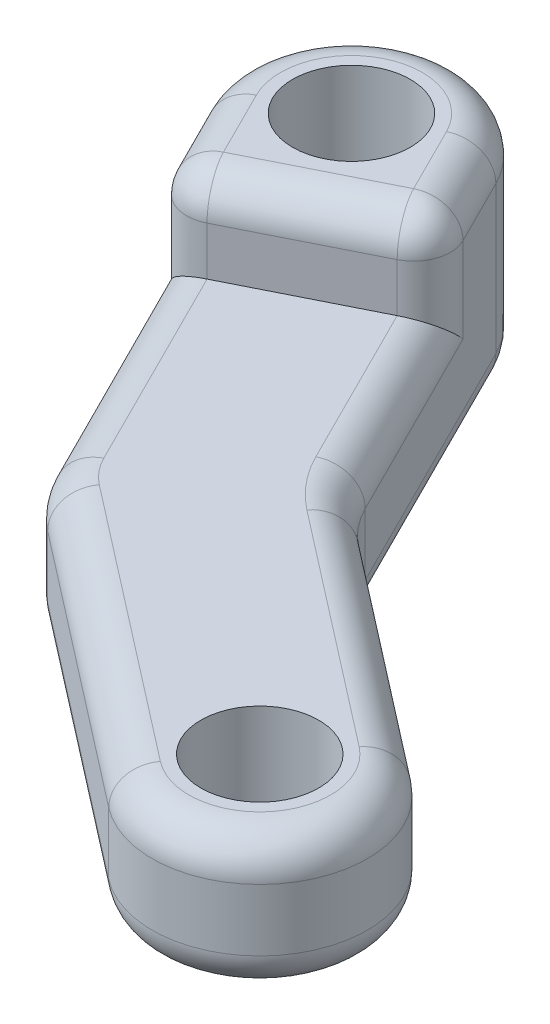
ISO-10303-21;
HEADER;
FILE_DESCRIPTION(('STEP AP214'),'2;1');
FILE_NAME('part.step','',(''),(''),'','','');
FILE_SCHEMA(('AUTOMOTIVE_DESIGN { 1 0 10303 214 1 1 1 1 }'));
ENDSEC;
DATA;
#1=APPLICATION_CONTEXT('core data for automotive mechanical design processes');
#2=APPLICATION_PROTOCOL_DEFINITION('international standard','automotive_design',2000,#1);
#3=PRODUCT_CONTEXT('',#1,'mechanical');
#4=PRODUCT('Part','Part','',(#3));
#5=PRODUCT_RELATED_PRODUCT_CATEGORY('part','',(#4));
#6=PRODUCT_DEFINITION_FORMATION('','',#4);
#7=PRODUCT_DEFINITION_CONTEXT('part definition',#1,'design');
#8=PRODUCT_DEFINITION('design','',#6,#7);
#9=PRODUCT_DEFINITION_SHAPE('','',#8);
#10=(LENGTH_UNIT() NAMED_UNIT(*) SI_UNIT(.MILLI.,.METRE.));
#11=(NAMED_UNIT(*) PLANE_ANGLE_UNIT() SI_UNIT($,.RADIAN.));
#12=(NAMED_UNIT(*) SI_UNIT($,.STERADIAN.) SOLID_ANGLE_UNIT());
#13=UNCERTAINTY_MEASURE_WITH_UNIT(LENGTH_MEASURE(1.E-05),#10,'distance_accuracy_value','');
#14=(GEOMETRIC_REPRESENTATION_CONTEXT(3) GLOBAL_UNCERTAINTY_ASSIGNED_CONTEXT((#13)) GLOBAL_UNIT_ASSIGNED_CONTEXT((#10,
#11,#12)) REPRESENTATION_CONTEXT('',''));
#15=CARTESIAN_POINT('',(0.,0.,0.));
#16=DIRECTION('',(0.,0.,1.));
#17=DIRECTION('',(1.,0.,0.));
#18=AXIS2_PLACEMENT_3D('',#15,#16,#17);
#19=CARTESIAN_POINT('',(-2.65869303179562,6.,-9.54953392256983));
#20=DIRECTION('',(0.,1.,0.));
#21=DIRECTION('',(0.,0.,1.));
#22=AXIS2_PLACEMENT_3D('',#19,#20,#21);
#23=PLANE('',#22);
#24=CARTESIAN_POINT('',(-11.5139500474512,6.,-14.0044940752888));
#25=DIRECTION('',(0.,1.,0.));
#26=DIRECTION('',(0.,0.,1.));
#27=AXIS2_PLACEMENT_3D('',#24,#25,#26);
#28=CIRCLE('',#27,1.6);
#29=CARTESIAN_POINT('',(-11.5139500474512,6.,-12.4044940752888));
#30=VERTEX_POINT('',#29);
#31=EDGE_CURVE('E196',#30,#30,#28,.T.);
#32=ORIENTED_EDGE('',*,*,#31,.F.);
#33=EDGE_LOOP('',(#32));
#34=FACE_BOUND('',#33,.T.);
#35=DIRECTION('',(0.447558447039831,0.,0.894254682114271));
#36=VECTOR('',#35,1.);
#37=CARTESIAN_POINT('',(-9.08189431283237,6.,-4.84395369232321));
#38=LINE('',#37,#36);
#39=CARTESIAN_POINT('',(-13.2353903105212,6.,-13.1429440647371));
#40=VERTEX_POINT('',#39);
#41=CARTESIAN_POINT('',(-12.3402734164415,6.,-11.3544347005086));
#42=VERTEX_POINT('',#41);
#43=EDGE_CURVE('E216',#40,#42,#38,.T.);
#44=ORIENTED_EDGE('',*,*,#43,.T.);
#45=DIRECTION('',(0.894254682114271,0.,-0.447558447039831));
#46=VECTOR('',#45,1.);
#47=CARTESIAN_POINT('',(-5.32037416184447,6.,-14.8677685097713));
#48=LINE('',#47,#46);
#49=CARTESIAN_POINT('',(-8.89739289030155,6.,-13.0775347216119));
#50=VERTEX_POINT('',#49);
#51=EDGE_CURVE('E344',#42,#50,#48,.T.);
#52=ORIENTED_EDGE('',*,*,#51,.T.);
#53=DIRECTION('',(-0.447558447039831,0.,-0.894254682114271));
#54=VECTOR('',#53,1.);
#55=CARTESIAN_POINT('',(-9.79250978438121,6.,-14.8660440858405));
#56=LINE('',#55,#54);
#57=CARTESIAN_POINT('',(-9.79250978438121,6.,-14.8660440858405));
#58=VERTEX_POINT('',#57);
#59=EDGE_CURVE('E270',#50,#58,#56,.T.);
#60=ORIENTED_EDGE('',*,*,#59,.T.);
#61=CARTESIAN_POINT('',(-11.5139500474512,6.,-14.0044940752888));
#62=DIRECTION('',(0.,1.,0.));
#63=DIRECTION('',(0.,0.,1.));
#64=AXIS2_PLACEMENT_3D('',#61,#62,#63);
#65=CIRCLE('',#64,1.925);
#66=EDGE_CURVE('E266',#58,#40,#65,.T.);
#67=ORIENTED_EDGE('',*,*,#66,.T.);
#68=EDGE_LOOP('',(#44,#52,#60,#67));
#69=FACE_BOUND('',#68,.T.);
#70=ADVANCED_FACE('F41',(#34,#69),#23,.T.);
#71=CARTESIAN_POINT('',(-2.65869303179562,6.,-9.54953392256983));
#72=DIRECTION('',(0.,-1.,0.));
#73=DIRECTION('',(0.,0.,-1.));
#74=AXIS2_PLACEMENT_3D('',#71,#72,#73);
#75=CYLINDRICAL_SURFACE('',#74,3.);
#76=DIRECTION('',(0.,-1.,0.));
#77=VECTOR('',#76,1.);
#78=CARTESIAN_POINT('',(-5.34145707813843,6.,-8.20685858145034));
#79=LINE('',#78,#77);
#80=CARTESIAN_POINT('',(-5.34145707813843,2.6825,-8.20685858145034));
#81=VERTEX_POINT('',#80);
#82=CARTESIAN_POINT('',(-5.34145707813843,1.,-8.20685858145034));
#83=VERTEX_POINT('',#82);
#84=EDGE_CURVE('E223',#81,#83,#79,.T.);
#85=ORIENTED_EDGE('',*,*,#84,.F.);
#86=CARTESIAN_POINT('',(-2.65869303179562,2.6825,-9.54953392256983));
#87=DIRECTION('',(0.,1.,0.));
#88=DIRECTION('',(0.,0.,1.));
#89=AXIS2_PLACEMENT_3D('',#86,#87,#88);
#90=CIRCLE('',#89,3.);
#91=CARTESIAN_POINT('',(-4.49475360434081,2.6825,-7.17700751092653));
#92=VERTEX_POINT('',#91);
#93=EDGE_CURVE('E193',#81,#92,#90,.T.);
#94=ORIENTED_EDGE('',*,*,#93,.T.);
#95=DIRECTION('',(0.,-1.,0.));
#96=VECTOR('',#95,1.);
#97=CARTESIAN_POINT('',(-4.49475360434081,6.,-7.17700751092653));
#98=LINE('',#97,#96);
#99=CARTESIAN_POINT('',(-4.49475360434081,1.,-7.17700751092653));
#100=VERTEX_POINT('',#99);
#101=EDGE_CURVE('E187',#92,#100,#98,.T.);
#102=ORIENTED_EDGE('',*,*,#101,.T.);
#103=CARTESIAN_POINT('',(-2.65869303179562,1.,-9.54953392256983));
#104=DIRECTION('',(0.,1.,0.));
#105=DIRECTION('',(0.,0.,1.));
#106=AXIS2_PLACEMENT_3D('',#103,#104,#105);
#107=CIRCLE('',#106,3.);
#108=EDGE_CURVE('E191',#100,#83,#107,.F.);
#109=ORIENTED_EDGE('',*,*,#108,.T.);
#110=EDGE_LOOP('',(#85,#94,#102,#109));
#111=FACE_BOUND('',#110,.T.);
#112=ADVANCED_FACE('F186',(#111),#75,.F.);
#113=CARTESIAN_POINT('',(-8.89825510226694,6.,-15.3136025328803));
#114=DIRECTION('',(-0.89425468211427,0.,0.447558447039831));
#115=DIRECTION('',(0.447558447039831,0.,0.894254682114271));
#116=AXIS2_PLACEMENT_3D('',#113,#114,#115);
#117=PLANE('',#116);
#118=DIRECTION('',(-0.447558447039831,0.,-0.894254682114271));
#119=VECTOR('',#118,1.);
#120=CARTESIAN_POINT('',(-5.34145707813843,5.,-8.20685858145034));
#121=LINE('',#120,#119);
#122=CARTESIAN_POINT('',(-8.89825510226694,5.,-15.3136025328803));
#123=VERTEX_POINT('',#122);
#124=CARTESIAN_POINT('',(-8.00313820818728,5.,-13.5250931686518));
#125=VERTEX_POINT('',#124);
#126=EDGE_CURVE('E264',#123,#125,#121,.F.);
#127=ORIENTED_EDGE('',*,*,#126,.T.);
#128=DIRECTION('',(0.,1.,0.));
#129=VECTOR('',#128,1.);
#130=CARTESIAN_POINT('',(-8.00313820818728,2.6825,-13.5250931686518));
#131=LINE('',#130,#129);
#132=CARTESIAN_POINT('',(-8.00313820818728,2.6825,-13.5250931686518));
#133=VERTEX_POINT('',#132);
#134=EDGE_CURVE('E357',#125,#133,#131,.F.);
#135=ORIENTED_EDGE('',*,*,#134,.T.);
#136=DIRECTION('',(0.447558447039831,0.,0.894254682114271));
#137=VECTOR('',#136,1.);
#138=CARTESIAN_POINT('',(-5.34145707813843,2.6825,-8.20685858145034));
#139=LINE('',#138,#137);
#140=EDGE_CURVE('E60',#133,#81,#139,.T.);
#141=ORIENTED_EDGE('',*,*,#140,.T.);
#142=ORIENTED_EDGE('',*,*,#84,.T.);
#143=DIRECTION('',(-0.447558447039831,0.,-0.894254682114271));
#144=VECTOR('',#143,1.);
#145=CARTESIAN_POINT('',(-8.89825510226694,1.,-15.3136025328803));
#146=LINE('',#145,#144);
#147=CARTESIAN_POINT('',(-8.89825510226694,1.,-15.3136025328803));
#148=VERTEX_POINT('',#147);
#149=EDGE_CURVE('E263',#83,#148,#146,.T.);
#150=ORIENTED_EDGE('',*,*,#149,.T.);
#151=DIRECTION('',(0.,-1.,0.));
#152=VECTOR('',#151,1.);
#153=CARTESIAN_POINT('',(-8.89825510226694,6.,-15.3136025328803));
#154=LINE('',#153,#152);
#155=EDGE_CURVE('E230',#123,#148,#154,.T.);
#156=ORIENTED_EDGE('',*,*,#155,.F.);
#157=EDGE_LOOP('',(#127,#135,#141,#142,#150,#156));
#158=FACE_BOUND('',#157,.T.);
#159=ADVANCED_FACE('F379',(#158),#117,.F.);
#160=CARTESIAN_POINT('',(-14.1296449926354,6.,-12.6953856176973));
#161=DIRECTION('',(0.89425468211427,0.,-0.447558447039831));
#162=DIRECTION('',(-0.447558447039831,0.,-0.894254682114271));
#163=AXIS2_PLACEMENT_3D('',#160,#161,#162);
#164=PLANE('',#163);
#165=DIRECTION('',(-0.447558447039831,0.,-0.894254682114271));
#166=VECTOR('',#165,1.);
#167=CARTESIAN_POINT('',(-12.7869696515159,2.6825,-10.0126215713545));
#168=LINE('',#167,#166);
#169=CARTESIAN_POINT('',(-9.97614899494664,2.6825,-4.39639524528338));
#170=VERTEX_POINT('',#169);
#171=CARTESIAN_POINT('',(-13.2345280985558,2.6825,-10.9068762534687));
#172=VERTEX_POINT('',#171);
#173=EDGE_CURVE('E64',#170,#172,#168,.T.);
#174=ORIENTED_EDGE('',*,*,#173,.T.);
#175=DIRECTION('',(0.,1.,0.));
#176=VECTOR('',#175,1.);
#177=CARTESIAN_POINT('',(-13.2345280985558,5.,-10.9068762534687));
#178=LINE('',#177,#176);
#179=CARTESIAN_POINT('',(-13.2345280985558,5.,-10.9068762534687));
#180=VERTEX_POINT('',#179);
#181=EDGE_CURVE('E353',#172,#180,#178,.T.);
#182=ORIENTED_EDGE('',*,*,#181,.T.);
#183=DIRECTION('',(0.447558447039831,0.,0.894254682114271));
#184=VECTOR('',#183,1.);
#185=CARTESIAN_POINT('',(-14.1296449926354,5.,-12.6953856176973));
#186=LINE('',#185,#184);
#187=CARTESIAN_POINT('',(-14.1296449926354,5.,-12.6953856176973));
#188=VERTEX_POINT('',#187);
#189=EDGE_CURVE('E254',#180,#188,#186,.F.);
#190=ORIENTED_EDGE('',*,*,#189,.T.);
#191=DIRECTION('',(0.,-1.,0.));
#192=VECTOR('',#191,1.);
#193=CARTESIAN_POINT('',(-14.1296449926354,6.,-12.6953856176973));
#194=LINE('',#193,#192);
#195=CARTESIAN_POINT('',(-14.1296449926354,1.,-12.6953856176973));
#196=VERTEX_POINT('',#195);
#197=EDGE_CURVE('E555',#188,#196,#194,.T.);
#198=ORIENTED_EDGE('',*,*,#197,.T.);
#199=DIRECTION('',(0.447558447039831,0.,0.894254682114271));
#200=VECTOR('',#199,1.);
#201=CARTESIAN_POINT('',(-14.1296449926354,1.,-12.6953856176973));
#202=LINE('',#201,#200);
#203=CARTESIAN_POINT('',(-9.97614899494664,1.,-4.39639524528338));
#204=VERTEX_POINT('',#203);
#205=EDGE_CURVE('E253',#196,#204,#202,.T.);
#206=ORIENTED_EDGE('',*,*,#205,.T.);
#207=DIRECTION('',(0.,-1.,0.));
#208=VECTOR('',#207,1.);
#209=CARTESIAN_POINT('',(-9.97614899494664,6.,-4.39639524528338));
#210=LINE('',#209,#208);
#211=EDGE_CURVE('E552',#170,#204,#210,.T.);
#212=ORIENTED_EDGE('',*,*,#211,.F.);
#213=EDGE_LOOP('',(#174,#182,#190,#198,#206,#212));
#214=FACE_BOUND('',#213,.T.);
#215=ADVANCED_FACE('F450',(#214),#164,.F.);
#216=CARTESIAN_POINT('',(-7.29338494860383,6.,-5.73907058640287));
#217=DIRECTION('',(0.,-1.,0.));
#218=DIRECTION('',(0.,0.,-1.));
#219=AXIS2_PLACEMENT_3D('',#216,#217,#218);
#220=CYLINDRICAL_SURFACE('',#219,3.);
#221=DIRECTION('',(0.,-1.,0.));
#222=VECTOR('',#221,1.);
#223=CARTESIAN_POINT('',(-9.12944552114902,6.,-3.36654417475957));
#224=LINE('',#223,#222);
#225=CARTESIAN_POINT('',(-9.12944552114902,2.6825,-3.36654417475957));
#226=VERTEX_POINT('',#225);
#227=CARTESIAN_POINT('',(-9.12944552114902,1.,-3.36654417475957));
#228=VERTEX_POINT('',#227);
#229=EDGE_CURVE('E548',#226,#228,#224,.T.);
#230=ORIENTED_EDGE('',*,*,#229,.F.);
#231=CARTESIAN_POINT('',(-7.29338494860383,2.6825,-5.73907058640287));
#232=DIRECTION('',(0.,1.,0.));
#233=DIRECTION('',(0.,0.,1.));
#234=AXIS2_PLACEMENT_3D('',#231,#232,#233);
#235=CIRCLE('',#234,3.);
#236=EDGE_CURVE('E312',#226,#170,#235,.F.);
#237=ORIENTED_EDGE('',*,*,#236,.T.);
#238=ORIENTED_EDGE('',*,*,#211,.T.);
#239=CARTESIAN_POINT('',(-7.29338494860383,1.,-5.73907058640287));
#240=DIRECTION('',(0.,1.,0.));
#241=DIRECTION('',(0.,0.,1.));
#242=AXIS2_PLACEMENT_3D('',#239,#240,#241);
#243=CIRCLE('',#242,3.);
#244=EDGE_CURVE('E249',#204,#228,#243,.T.);
#245=ORIENTED_EDGE('',*,*,#244,.T.);
#246=EDGE_LOOP('',(#230,#237,#238,#245));
#247=FACE_BOUND('',#246,.T.);
#248=ADVANCED_FACE('F442',(#247),#220,.T.);
#249=CARTESIAN_POINT('',(-9.12944552114902,6.,-3.36654417475957));
#250=DIRECTION('',(0.612020190848396,0.,-0.790842137214433));
#251=DIRECTION('',(-0.790842137214433,0.,-0.612020190848396));
#252=AXIS2_PLACEMENT_3D('',#249,#250,#251);
#253=PLANE('',#252);
#254=DIRECTION('',(0.,-1.,0.));
#255=VECTOR('',#254,1.);
#256=CARTESIAN_POINT('',(-1.79015905823156,6.,2.31321325135222));
#257=LINE('',#256,#255);
#258=CARTESIAN_POINT('',(-1.79015905823156,2.6825,2.31321325135222));
#259=VERTEX_POINT('',#258);
#260=CARTESIAN_POINT('',(-1.79015905823156,1.,2.31321325135222));
#261=VERTEX_POINT('',#260);
#262=EDGE_CURVE('E549',#259,#261,#257,.T.);
#263=ORIENTED_EDGE('',*,*,#262,.F.);
#264=DIRECTION('',(-0.790842137214433,0.,-0.612020190848396));
#265=VECTOR('',#264,1.);
#266=CARTESIAN_POINT('',(-9.12944552114902,2.6825,-3.36654417475957));
#267=LINE('',#266,#265);
#268=EDGE_CURVE('E314',#259,#226,#267,.T.);
#269=ORIENTED_EDGE('',*,*,#268,.T.);
#270=ORIENTED_EDGE('',*,*,#229,.T.);
#271=DIRECTION('',(0.790842137214433,0.,0.612020190848396));
#272=VECTOR('',#271,1.);
#273=CARTESIAN_POINT('',(-9.12944552114902,1.,-3.36654417475957));
#274=LINE('',#273,#272);
#275=EDGE_CURVE('E250',#228,#261,#274,.T.);
#276=ORIENTED_EDGE('',*,*,#275,.T.);
#277=EDGE_LOOP('',(#263,#269,#270,#276));
#278=FACE_BOUND('',#277,.T.);
#279=ADVANCED_FACE('F437',(#278),#253,.F.);
#280=CARTESIAN_POINT('',(0.,6.,0.));
#281=DIRECTION('',(0.,-1.,0.));
#282=DIRECTION('',(0.,0.,-1.));
#283=AXIS2_PLACEMENT_3D('',#280,#281,#282);
#284=CYLINDRICAL_SURFACE('',#283,2.925);
#285=DIRECTION('',(0.,-1.,0.));
#286=VECTOR('',#285,1.);
#287=CARTESIAN_POINT('',(1.79015905823156,6.,-2.31321325135222));
#288=LINE('',#287,#286);
#289=CARTESIAN_POINT('',(1.79015905823156,2.6825,-2.31321325135222));
#290=VERTEX_POINT('',#289);
#291=CARTESIAN_POINT('',(1.79015905823156,1.,-2.31321325135222));
#292=VERTEX_POINT('',#291);
#293=EDGE_CURVE('E200',#290,#292,#288,.T.);
#294=ORIENTED_EDGE('',*,*,#293,.F.);
#295=CARTESIAN_POINT('',(0.,2.6825,0.));
#296=DIRECTION('',(0.,1.,0.));
#297=DIRECTION('',(0.,0.,1.));
#298=AXIS2_PLACEMENT_3D('',#295,#296,#297);
#299=CIRCLE('',#298,2.925);
#300=EDGE_CURVE('E321',#290,#259,#299,.F.);
#301=ORIENTED_EDGE('',*,*,#300,.T.);
#302=ORIENTED_EDGE('',*,*,#262,.T.);
#303=CARTESIAN_POINT('',(0.,1.,0.));
#304=DIRECTION('',(0.,1.,0.));
#305=DIRECTION('',(0.,0.,1.));
#306=AXIS2_PLACEMENT_3D('',#303,#304,#305);
#307=CIRCLE('',#306,2.925);
#308=EDGE_CURVE('E244',#261,#292,#307,.T.);
#309=ORIENTED_EDGE('',*,*,#308,.T.);
#310=EDGE_LOOP('',(#294,#301,#302,#309));
#311=FACE_BOUND('',#310,.T.);
#312=ADVANCED_FACE('F436',(#311),#284,.T.);
#313=CARTESIAN_POINT('',(-4.49475360434081,6.,-7.17700751092653));
#314=DIRECTION('',(-0.612020190848396,0.,0.790842137214433));
#315=DIRECTION('',(0.790842137214433,0.,0.612020190848396));
#316=AXIS2_PLACEMENT_3D('',#313,#314,#315);
#317=PLANE('',#316);
#318=ORIENTED_EDGE('',*,*,#101,.F.);
#319=DIRECTION('',(0.790842137214433,0.,0.612020190848396));
#320=VECTOR('',#319,1.);
#321=CARTESIAN_POINT('',(1.79015905823156,2.6825,-2.31321325135222));
#322=LINE('',#321,#320);
#323=EDGE_CURVE('E316',#92,#290,#322,.T.);
#324=ORIENTED_EDGE('',*,*,#323,.T.);
#325=ORIENTED_EDGE('',*,*,#293,.T.);
#326=DIRECTION('',(-0.790842137214433,0.,-0.612020190848396));
#327=VECTOR('',#326,1.);
#328=CARTESIAN_POINT('',(-4.49475360434081,1.,-7.17700751092653));
#329=LINE('',#328,#327);
#330=EDGE_CURVE('E210',#292,#100,#329,.T.);
#331=ORIENTED_EDGE('',*,*,#330,.T.);
#332=EDGE_LOOP('',(#318,#324,#325,#331));
#333=FACE_BOUND('',#332,.T.);
#334=ADVANCED_FACE('F222',(#333),#317,.F.);
#335=CARTESIAN_POINT('',(0.,6.,0.));
#336=DIRECTION('',(0.,-1.,0.));
#337=DIRECTION('',(0.,0.,-1.));
#338=AXIS2_PLACEMENT_3D('',#335,#336,#337);
#339=CYLINDRICAL_SURFACE('',#338,1.6);
#340=CARTESIAN_POINT('',(0.,0.,0.));
#341=DIRECTION('',(0.,1.,0.));
#342=DIRECTION('',(0.,0.,1.));
#343=AXIS2_PLACEMENT_3D('',#340,#341,#342);
#344=CIRCLE('',#343,1.6);
#345=CARTESIAN_POINT('',(0.,0.,1.6));
#346=VERTEX_POINT('',#345);
#347=EDGE_CURVE('E288',#346,#346,#344,.T.);
#348=ORIENTED_EDGE('',*,*,#347,.F.);
#349=EDGE_LOOP('',(#348));
#350=FACE_BOUND('',#349,.T.);
#351=CARTESIAN_POINT('',(0.,3.6825,0.));
#352=DIRECTION('',(0.,1.,0.));
#353=DIRECTION('',(0.,0.,1.));
#354=AXIS2_PLACEMENT_3D('',#351,#352,#353);
#355=CIRCLE('',#354,1.6);
#356=CARTESIAN_POINT('',(0.,3.6825,1.6));
#357=VERTEX_POINT('',#356);
#358=EDGE_CURVE('E295',#357,#357,#355,.F.);
#359=ORIENTED_EDGE('',*,*,#358,.F.);
#360=EDGE_LOOP('',(#359));
#361=FACE_BOUND('',#360,.T.);
#362=ADVANCED_FACE('F434',(#350,#361),#339,.F.);
#363=CARTESIAN_POINT('',(-9.67859228639264,5.,-6.03620011330716));
#364=DIRECTION('',(-0.447558447039831,0.,-0.894254682114271));
#365=DIRECTION('',(-0.89425468211427,0.,0.447558447039831));
#366=AXIS2_PLACEMENT_3D('',#363,#364,#365);
#367=CYLINDRICAL_SURFACE('',#366,1.);
#368=ORIENTED_EDGE('',*,*,#189,.F.);
#369=CARTESIAN_POINT('',(-12.3402734164415,5.,-11.3544347005086));
#370=DIRECTION('',(-0.447558447039831,0.,-0.894254682114271));
#371=DIRECTION('',(-0.89425468211427,0.,0.447558447039831));
#372=AXIS2_PLACEMENT_3D('',#369,#370,#371);
#373=CIRCLE('',#372,1.);
#374=EDGE_CURVE('E322',#180,#42,#373,.T.);
#375=ORIENTED_EDGE('',*,*,#374,.T.);
#376=ORIENTED_EDGE('',*,*,#43,.F.);
#377=CARTESIAN_POINT('',(-13.2353903105212,5.,-13.1429440647371));
#378=DIRECTION('',(-0.447558447039831,0.,-0.89425468211427));
#379=DIRECTION('',(-0.89425468211427,0.,0.447558447039831));
#380=AXIS2_PLACEMENT_3D('',#377,#378,#379);
#381=CIRCLE('',#380,1.);
#382=EDGE_CURVE('E212',#188,#40,#381,.T.);
#383=ORIENTED_EDGE('',*,*,#382,.F.);
#384=EDGE_LOOP('',(#368,#375,#376,#383));
#385=FACE_BOUND('',#384,.T.);
#386=ADVANCED_FACE('F400',(#385),#367,.T.);
#387=CARTESIAN_POINT('',(-6.2357117602527,5.,-7.75930013441051));
#388=DIRECTION('',(0.447558447039831,0.,0.894254682114271));
#389=DIRECTION('',(0.894254682114271,0.,-0.447558447039831));
#390=AXIS2_PLACEMENT_3D('',#387,#388,#389);
#391=CYLINDRICAL_SURFACE('',#390,1.);
#392=ORIENTED_EDGE('',*,*,#59,.F.);
#393=CARTESIAN_POINT('',(-8.89739289030155,5.,-13.0775347216119));
#394=DIRECTION('',(0.447558447039831,0.,0.894254682114271));
#395=DIRECTION('',(0.894254682114271,0.,-0.447558447039831));
#396=AXIS2_PLACEMENT_3D('',#393,#394,#395);
#397=CIRCLE('',#396,1.);
#398=EDGE_CURVE('E354',#50,#125,#397,.F.);
#399=ORIENTED_EDGE('',*,*,#398,.T.);
#400=ORIENTED_EDGE('',*,*,#126,.F.);
#401=CARTESIAN_POINT('',(-9.79250978438121,5.,-14.8660440858405));
#402=DIRECTION('',(0.447558447039831,0.,0.89425468211427));
#403=DIRECTION('',(0.89425468211427,0.,-0.447558447039831));
#404=AXIS2_PLACEMENT_3D('',#401,#402,#403);
#405=CIRCLE('',#404,1.);
#406=EDGE_CURVE('E293',#123,#58,#405,.T.);
#407=ORIENTED_EDGE('',*,*,#406,.T.);
#408=EDGE_LOOP('',(#392,#399,#400,#407));
#409=FACE_BOUND('',#408,.T.);
#410=ADVANCED_FACE('F390',(#409),#391,.T.);
#411=CARTESIAN_POINT('',(-2.65869303179562,0.,-9.54953392256983));
#412=DIRECTION('',(0.,1.,0.));
#413=DIRECTION('',(0.,0.,1.));
#414=AXIS2_PLACEMENT_3D('',#411,#412,#413);
#415=PLANE('',#414);
#416=CARTESIAN_POINT('',(-2.65869303179562,0.,-9.54953392256983));
#417=DIRECTION('',(0.,1.,0.));
#418=DIRECTION('',(0.,0.,1.));
#419=AXIS2_PLACEMENT_3D('',#416,#417,#418);
#420=CIRCLE('',#419,4.);
#421=CARTESIAN_POINT('',(-6.2357117602527,0.,-7.75930013441051));
#422=VERTEX_POINT('',#421);
#423=CARTESIAN_POINT('',(-5.10677379518921,0.,-6.3861653737121));
#424=VERTEX_POINT('',#423);
#425=EDGE_CURVE('E221',#422,#424,#420,.T.);
#426=ORIENTED_EDGE('',*,*,#425,.T.);
#427=DIRECTION('',(-0.790842137214433,0.,-0.612020190848396));
#428=VECTOR('',#427,1.);
#429=CARTESIAN_POINT('',(-5.10677379518921,0.,-6.3861653737121));
#430=LINE('',#429,#428);
#431=CARTESIAN_POINT('',(1.17813886738317,0.,-1.52237111413778));
#432=VERTEX_POINT('',#431);
#433=EDGE_CURVE('E209',#424,#432,#430,.F.);
#434=ORIENTED_EDGE('',*,*,#433,.T.);
#435=CARTESIAN_POINT('',(0.,0.,0.));
#436=DIRECTION('',(0.,1.,0.));
#437=DIRECTION('',(0.,0.,1.));
#438=AXIS2_PLACEMENT_3D('',#435,#436,#437);
#439=CIRCLE('',#438,1.925);
#440=CARTESIAN_POINT('',(-1.17813886738316,0.,1.52237111413779));
#441=VERTEX_POINT('',#440);
#442=EDGE_CURVE('E245',#432,#441,#439,.F.);
#443=ORIENTED_EDGE('',*,*,#442,.T.);
#444=DIRECTION('',(0.790842137214433,0.,0.612020190848396));
#445=VECTOR('',#444,1.);
#446=CARTESIAN_POINT('',(-7.46305152995553,0.,-3.34142314543653));
#447=LINE('',#446,#445);
#448=CARTESIAN_POINT('',(-8.51742533030062,0.,-4.157386311974));
#449=VERTEX_POINT('',#448);
#450=EDGE_CURVE('E239',#441,#449,#447,.F.);
#451=ORIENTED_EDGE('',*,*,#450,.T.);
#452=CARTESIAN_POINT('',(-7.29338494860383,0.,-5.73907058640287));
#453=DIRECTION('',(0.,1.,0.));
#454=DIRECTION('',(0.,0.,1.));
#455=AXIS2_PLACEMENT_3D('',#452,#453,#454);
#456=CIRCLE('',#455,2.);
#457=CARTESIAN_POINT('',(-9.08189431283237,0.,-4.84395369232321));
#458=VERTEX_POINT('',#457);
#459=EDGE_CURVE('E238',#449,#458,#456,.F.);
#460=ORIENTED_EDGE('',*,*,#459,.T.);
#461=DIRECTION('',(0.447558447039831,0.,0.894254682114271));
#462=VECTOR('',#461,1.);
#463=CARTESIAN_POINT('',(-9.67859228639264,0.,-6.03620011330716));
#464=LINE('',#463,#462);
#465=CARTESIAN_POINT('',(-13.2353903105212,0.,-13.1429440647371));
#466=VERTEX_POINT('',#465);
#467=EDGE_CURVE('E236',#458,#466,#464,.F.);
#468=ORIENTED_EDGE('',*,*,#467,.T.);
#469=CARTESIAN_POINT('',(-11.5139500474512,0.,-14.0044940752888));
#470=DIRECTION('',(0.,1.,0.));
#471=DIRECTION('',(0.,0.,1.));
#472=AXIS2_PLACEMENT_3D('',#469,#470,#471);
#473=CIRCLE('',#472,1.925);
#474=CARTESIAN_POINT('',(-9.79250978438121,0.,-14.8660440858405));
#475=VERTEX_POINT('',#474);
#476=EDGE_CURVE('E234',#466,#475,#473,.F.);
#477=ORIENTED_EDGE('',*,*,#476,.T.);
#478=DIRECTION('',(-0.447558447039831,0.,-0.894254682114271));
#479=VECTOR('',#478,1.);
#480=CARTESIAN_POINT('',(-6.23571176025271,0.,-7.75930013441051));
#481=LINE('',#480,#479);
#482=EDGE_CURVE('E227',#475,#422,#481,.F.);
#483=ORIENTED_EDGE('',*,*,#482,.T.);
#484=EDGE_LOOP('',(#426,#434,#443,#451,#460,#468,#477,#483));
#485=FACE_BOUND('',#484,.T.);
#486=CARTESIAN_POINT('',(-11.5139500474512,0.,-14.0044940752888));
#487=DIRECTION('',(0.,1.,0.));
#488=DIRECTION('',(0.,0.,1.));
#489=AXIS2_PLACEMENT_3D('',#486,#487,#488);
#490=CIRCLE('',#489,1.6);
#491=CARTESIAN_POINT('',(-11.5139500474512,0.,-12.4044940752888));
#492=VERTEX_POINT('',#491);
#493=EDGE_CURVE('E544',#492,#492,#490,.T.);
#494=ORIENTED_EDGE('',*,*,#493,.T.);
#495=EDGE_LOOP('',(#494));
#496=FACE_BOUND('',#495,.T.);
#497=ORIENTED_EDGE('',*,*,#347,.T.);
#498=EDGE_LOOP('',(#497));
#499=FACE_BOUND('',#498,.T.);
#500=ADVANCED_FACE('F426',(#485,#496,#499),#415,.F.);
#501=CARTESIAN_POINT('',(-11.5139500474512,6.,-14.0044940752888));
#502=DIRECTION('',(0.,-1.,0.));
#503=DIRECTION('',(0.,0.,-1.));
#504=AXIS2_PLACEMENT_3D('',#501,#502,#503);
#505=CYLINDRICAL_SURFACE('',#504,2.925);
#506=ORIENTED_EDGE('',*,*,#155,.T.);
#507=CARTESIAN_POINT('',(-11.5139500474512,1.,-14.0044940752888));
#508=DIRECTION('',(0.,1.,0.));
#509=DIRECTION('',(0.,0.,1.));
#510=AXIS2_PLACEMENT_3D('',#507,#508,#509);
#511=CIRCLE('',#510,2.925);
#512=EDGE_CURVE('E259',#148,#196,#511,.T.);
#513=ORIENTED_EDGE('',*,*,#512,.T.);
#514=ORIENTED_EDGE('',*,*,#197,.F.);
#515=CARTESIAN_POINT('',(-11.5139500474512,5.,-14.0044940752888));
#516=DIRECTION('',(0.,1.,0.));
#517=DIRECTION('',(0.,0.,1.));
#518=AXIS2_PLACEMENT_3D('',#515,#516,#517);
#519=CIRCLE('',#518,2.925);
#520=EDGE_CURVE('E257',#188,#123,#519,.F.);
#521=ORIENTED_EDGE('',*,*,#520,.T.);
#522=EDGE_LOOP('',(#506,#513,#514,#521));
#523=FACE_BOUND('',#522,.T.);
#524=ADVANCED_FACE('F431',(#523),#505,.T.);
#525=CARTESIAN_POINT('',(-11.5139500474512,6.,-14.0044940752888));
#526=DIRECTION('',(0.,-1.,0.));
#527=DIRECTION('',(0.,0.,-1.));
#528=AXIS2_PLACEMENT_3D('',#525,#526,#527);
#529=CYLINDRICAL_SURFACE('',#528,1.6);
#530=ORIENTED_EDGE('',*,*,#31,.T.);
#531=EDGE_LOOP('',(#530));
#532=FACE_BOUND('',#531,.T.);
#533=ORIENTED_EDGE('',*,*,#493,.F.);
#534=EDGE_LOOP('',(#533));
#535=FACE_BOUND('',#534,.T.);
#536=ADVANCED_FACE('F428',(#532,#535),#529,.F.);
#537=CARTESIAN_POINT('',(-13.2353903105212,1.,-13.1429440647371));
#538=DIRECTION('',(0.447558447039831,0.,0.894254682114271));
#539=DIRECTION('',(0.89425468211427,0.,-0.447558447039831));
#540=AXIS2_PLACEMENT_3D('',#537,#538,#539);
#541=CYLINDRICAL_SURFACE('',#540,1.);
#542=CARTESIAN_POINT('',(-13.2353903105212,1.,-13.1429440647371));
#543=DIRECTION('',(-0.447558447039831,0.,-0.89425468211427));
#544=DIRECTION('',(-0.89425468211427,0.,0.447558447039831));
#545=AXIS2_PLACEMENT_3D('',#542,#543,#544);
#546=CIRCLE('',#545,1.);
#547=EDGE_CURVE('E281',#466,#196,#546,.T.);
#548=ORIENTED_EDGE('',*,*,#547,.F.);
#549=ORIENTED_EDGE('',*,*,#467,.F.);
#550=CARTESIAN_POINT('',(-9.08189431283237,1.,-4.84395369232321));
#551=DIRECTION('',(0.447558447039831,0.,0.89425468211427));
#552=DIRECTION('',(0.89425468211427,0.,-0.447558447039831));
#553=AXIS2_PLACEMENT_3D('',#550,#551,#552);
#554=CIRCLE('',#553,1.);
#555=EDGE_CURVE('E290',#204,#458,#554,.T.);
#556=ORIENTED_EDGE('',*,*,#555,.F.);
#557=ORIENTED_EDGE('',*,*,#205,.F.);
#558=EDGE_LOOP('',(#548,#549,#556,#557));
#559=FACE_BOUND('',#558,.T.);
#560=ADVANCED_FACE('F480',(#559),#541,.T.);
#561=CARTESIAN_POINT('',(-7.29338494860383,1.,-5.73907058640287));
#562=DIRECTION('',(0.,1.,0.));
#563=DIRECTION('',(0.,0.,1.));
#564=AXIS2_PLACEMENT_3D('',#561,#562,#563);
#565=TOROIDAL_SURFACE('',#564,2.,1.);
#566=ORIENTED_EDGE('',*,*,#555,.T.);
#567=ORIENTED_EDGE('',*,*,#459,.F.);
#568=CARTESIAN_POINT('',(-8.51742533030062,1.,-4.157386311974));
#569=DIRECTION('',(0.790842137214434,0.,0.612020190848396));
#570=DIRECTION('',(0.612020190848396,0.,-0.790842137214434));
#571=AXIS2_PLACEMENT_3D('',#568,#569,#570);
#572=CIRCLE('',#571,1.);
#573=EDGE_CURVE('E282',#228,#449,#572,.T.);
#574=ORIENTED_EDGE('',*,*,#573,.F.);
#575=ORIENTED_EDGE('',*,*,#244,.F.);
#576=EDGE_LOOP('',(#566,#567,#574,#575));
#577=FACE_BOUND('',#576,.T.);
#578=ADVANCED_FACE('F473',(#577),#565,.T.);
#579=CARTESIAN_POINT('',(-11.5139500474512,1.,-14.0044940752888));
#580=DIRECTION('',(0.,1.,0.));
#581=DIRECTION('',(0.,0.,1.));
#582=AXIS2_PLACEMENT_3D('',#579,#580,#581);
#583=TOROIDAL_SURFACE('',#582,1.925,1.);
#584=ORIENTED_EDGE('',*,*,#547,.T.);
#585=ORIENTED_EDGE('',*,*,#512,.F.);
#586=CARTESIAN_POINT('',(-9.79250978438121,1.,-14.8660440858405));
#587=DIRECTION('',(0.447558447039831,0.,0.89425468211427));
#588=DIRECTION('',(0.89425468211427,0.,-0.447558447039831));
#589=AXIS2_PLACEMENT_3D('',#586,#587,#588);
#590=CIRCLE('',#589,1.);
#591=EDGE_CURVE('E277',#475,#148,#590,.T.);
#592=ORIENTED_EDGE('',*,*,#591,.F.);
#593=ORIENTED_EDGE('',*,*,#476,.F.);
#594=EDGE_LOOP('',(#584,#585,#592,#593));
#595=FACE_BOUND('',#594,.T.);
#596=ADVANCED_FACE('F468',(#595),#583,.T.);
#597=CARTESIAN_POINT('',(-8.51742533030062,1.,-4.157386311974));
#598=DIRECTION('',(0.790842137214433,0.,0.612020190848396));
#599=DIRECTION('',(0.612020190848396,0.,-0.790842137214433));
#600=AXIS2_PLACEMENT_3D('',#597,#598,#599);
#601=CYLINDRICAL_SURFACE('',#600,1.);
#602=ORIENTED_EDGE('',*,*,#573,.T.);
#603=ORIENTED_EDGE('',*,*,#450,.F.);
#604=CARTESIAN_POINT('',(-1.17813886738316,1.,1.52237111413778));
#605=DIRECTION('',(0.790842137214433,0.,0.612020190848396));
#606=DIRECTION('',(0.612020190848396,0.,-0.790842137214433));
#607=AXIS2_PLACEMENT_3D('',#604,#605,#606);
#608=CIRCLE('',#607,1.);
#609=EDGE_CURVE('E273',#261,#441,#608,.T.);
#610=ORIENTED_EDGE('',*,*,#609,.F.);
#611=ORIENTED_EDGE('',*,*,#275,.F.);
#612=EDGE_LOOP('',(#602,#603,#610,#611));
#613=FACE_BOUND('',#612,.T.);
#614=ADVANCED_FACE('F467',(#613),#601,.T.);
#615=CARTESIAN_POINT('',(-9.79250978438121,1.,-14.8660440858405));
#616=DIRECTION('',(-0.447558447039831,0.,-0.894254682114271));
#617=DIRECTION('',(-0.894254682114271,0.,0.447558447039831));
#618=AXIS2_PLACEMENT_3D('',#615,#616,#617);
#619=CYLINDRICAL_SURFACE('',#618,1.);
#620=ORIENTED_EDGE('',*,*,#591,.T.);
#621=ORIENTED_EDGE('',*,*,#149,.F.);
#622=CARTESIAN_POINT('',(-6.2357117602527,1.,-7.75930013441051));
#623=DIRECTION('',(0.447558447039831,0.,0.89425468211427));
#624=DIRECTION('',(0.89425468211427,0.,-0.447558447039831));
#625=AXIS2_PLACEMENT_3D('',#622,#623,#624);
#626=CIRCLE('',#625,1.);
#627=EDGE_CURVE('E220',#422,#83,#626,.T.);
#628=ORIENTED_EDGE('',*,*,#627,.F.);
#629=ORIENTED_EDGE('',*,*,#482,.F.);
#630=EDGE_LOOP('',(#620,#621,#628,#629));
#631=FACE_BOUND('',#630,.T.);
#632=ADVANCED_FACE('F465',(#631),#619,.T.);
#633=CARTESIAN_POINT('',(0.,1.,0.));
#634=DIRECTION('',(0.,1.,0.));
#635=DIRECTION('',(0.,0.,1.));
#636=AXIS2_PLACEMENT_3D('',#633,#634,#635);
#637=TOROIDAL_SURFACE('',#636,1.925,1.);
#638=ORIENTED_EDGE('',*,*,#609,.T.);
#639=ORIENTED_EDGE('',*,*,#442,.F.);
#640=CARTESIAN_POINT('',(1.17813886738317,1.,-1.52237111413778));
#641=DIRECTION('',(-0.790842137214433,0.,-0.612020190848397));
#642=DIRECTION('',(-0.612020190848397,0.,0.790842137214433));
#643=AXIS2_PLACEMENT_3D('',#640,#641,#642);
#644=CIRCLE('',#643,1.);
#645=EDGE_CURVE('E215',#292,#432,#644,.T.);
#646=ORIENTED_EDGE('',*,*,#645,.F.);
#647=ORIENTED_EDGE('',*,*,#308,.F.);
#648=EDGE_LOOP('',(#638,#639,#646,#647));
#649=FACE_BOUND('',#648,.T.);
#650=ADVANCED_FACE('F456',(#649),#637,.T.);
#651=CARTESIAN_POINT('',(-2.65869303179562,1.,-9.54953392256983));
#652=DIRECTION('',(0.,1.,0.));
#653=DIRECTION('',(0.,0.,1.));
#654=AXIS2_PLACEMENT_3D('',#651,#652,#653);
#655=TOROIDAL_SURFACE('',#654,4.,1.);
#656=ORIENTED_EDGE('',*,*,#627,.T.);
#657=ORIENTED_EDGE('',*,*,#108,.F.);
#658=CARTESIAN_POINT('',(-5.10677379518921,1.,-6.3861653737121));
#659=DIRECTION('',(0.790842137214433,0.,0.612020190848397));
#660=DIRECTION('',(0.612020190848397,0.,-0.790842137214433));
#661=AXIS2_PLACEMENT_3D('',#658,#659,#660);
#662=CIRCLE('',#661,1.);
#663=EDGE_CURVE('E203',#424,#100,#662,.T.);
#664=ORIENTED_EDGE('',*,*,#663,.F.);
#665=ORIENTED_EDGE('',*,*,#425,.F.);
#666=EDGE_LOOP('',(#656,#657,#664,#665));
#667=FACE_BOUND('',#666,.T.);
#668=ADVANCED_FACE('F217',(#667),#655,.T.);
#669=CARTESIAN_POINT('',(-5.10677379518921,1.,-6.3861653737121));
#670=DIRECTION('',(-0.790842137214433,0.,-0.612020190848396));
#671=DIRECTION('',(-0.612020190848396,0.,0.790842137214433));
#672=AXIS2_PLACEMENT_3D('',#669,#670,#671);
#673=CYLINDRICAL_SURFACE('',#672,1.);
#674=ORIENTED_EDGE('',*,*,#645,.T.);
#675=ORIENTED_EDGE('',*,*,#433,.F.);
#676=ORIENTED_EDGE('',*,*,#663,.T.);
#677=ORIENTED_EDGE('',*,*,#330,.F.);
#678=EDGE_LOOP('',(#674,#675,#676,#677));
#679=FACE_BOUND('',#678,.T.);
#680=ADVANCED_FACE('F207',(#679),#673,.T.);
#681=CARTESIAN_POINT('',(-11.5139500474512,5.,-14.0044940752888));
#682=DIRECTION('',(0.,1.,0.));
#683=DIRECTION('',(0.,0.,1.));
#684=AXIS2_PLACEMENT_3D('',#681,#682,#683);
#685=TOROIDAL_SURFACE('',#684,1.925,1.);
#686=ORIENTED_EDGE('',*,*,#382,.T.);
#687=ORIENTED_EDGE('',*,*,#66,.F.);
#688=ORIENTED_EDGE('',*,*,#406,.F.);
#689=ORIENTED_EDGE('',*,*,#520,.F.);
#690=EDGE_LOOP('',(#686,#687,#688,#689));
#691=FACE_BOUND('',#690,.T.);
#692=ADVANCED_FACE('F394',(#691),#685,.T.);
#693=CARTESIAN_POINT('',(-6.56870343759184,3.6825,-13.1247524057206));
#694=DIRECTION('',(0.447558447039831,0.,0.89425468211427));
#695=DIRECTION('',(0.894254682114271,0.,-0.447558447039831));
#696=AXIS2_PLACEMENT_3D('',#693,#694,#695);
#697=PLANE('',#696);
#698=DIRECTION('',(0.894254682114271,0.,-0.447558447039831));
#699=VECTOR('',#698,1.);
#700=CARTESIAN_POINT('',(-6.56870343759184,5.,-13.1247524057206));
#701=LINE('',#700,#699);
#702=CARTESIAN_POINT('',(-8.44983444326172,5.,-12.1832800394977));
#703=VERTEX_POINT('',#702);
#704=CARTESIAN_POINT('',(-11.8927149694017,5.,-10.4601800183943));
#705=VERTEX_POINT('',#704);
#706=EDGE_CURVE('E346',#703,#705,#701,.F.);
#707=ORIENTED_EDGE('',*,*,#706,.T.);
#708=DIRECTION('',(0.,1.,0.));
#709=VECTOR('',#708,1.);
#710=CARTESIAN_POINT('',(-11.8927149694017,2.6825,-10.4601800183943));
#711=LINE('',#710,#709);
#712=CARTESIAN_POINT('',(-11.8927149694017,3.6825,-10.4601800183943));
#713=VERTEX_POINT('',#712);
#714=EDGE_CURVE('E352',#705,#713,#711,.F.);
#715=ORIENTED_EDGE('',*,*,#714,.T.);
#716=DIRECTION('',(0.89425468211427,0.,-0.447558447039831));
#717=VECTOR('',#716,1.);
#718=CARTESIAN_POINT('',(-6.56870343759184,3.6825,-13.1247524057206));
#719=LINE('',#718,#717);
#720=CARTESIAN_POINT('',(-8.44983444326172,3.6825,-12.1832800394977));
#721=VERTEX_POINT('',#720);
#722=EDGE_CURVE('E345',#713,#721,#719,.T.);
#723=ORIENTED_EDGE('',*,*,#722,.T.);
#724=DIRECTION('',(0.,1.,0.));
#725=VECTOR('',#724,1.);
#726=CARTESIAN_POINT('',(-8.44983444326172,5.,-12.1832800394977));
#727=LINE('',#726,#725);
#728=EDGE_CURVE('E349',#721,#703,#727,.T.);
#729=ORIENTED_EDGE('',*,*,#728,.T.);
#730=EDGE_LOOP('',(#707,#715,#723,#729));
#731=FACE_BOUND('',#730,.T.);
#732=ADVANCED_FACE('F487',(#731),#697,.T.);
#733=CARTESIAN_POINT('',(0.,3.6825,0.));
#734=DIRECTION('',(0.,1.,0.));
#735=DIRECTION('',(0.,0.,1.));
#736=AXIS2_PLACEMENT_3D('',#733,#734,#735);
#737=PLANE('',#736);
#738=ORIENTED_EDGE('',*,*,#722,.F.);
#739=DIRECTION('',(-0.447558447039831,0.,-0.894254682114271));
#740=VECTOR('',#739,1.);
#741=CARTESIAN_POINT('',(-9.08189431283237,3.6825,-4.84395369232321));
#742=LINE('',#741,#740);
#743=CARTESIAN_POINT('',(-9.08189431283237,3.6825,-4.84395369232321));
#744=VERTEX_POINT('',#743);
#745=EDGE_CURVE('E311',#713,#744,#742,.F.);
#746=ORIENTED_EDGE('',*,*,#745,.T.);
#747=CARTESIAN_POINT('',(-7.29338494860383,3.6825,-5.73907058640287));
#748=DIRECTION('',(0.,1.,0.));
#749=DIRECTION('',(0.,0.,1.));
#750=AXIS2_PLACEMENT_3D('',#747,#748,#749);
#751=CIRCLE('',#750,2.);
#752=CARTESIAN_POINT('',(-8.51742533030062,3.6825,-4.157386311974));
#753=VERTEX_POINT('',#752);
#754=EDGE_CURVE('E307',#744,#753,#751,.T.);
#755=ORIENTED_EDGE('',*,*,#754,.T.);
#756=DIRECTION('',(-0.790842137214433,0.,-0.612020190848396));
#757=VECTOR('',#756,1.);
#758=CARTESIAN_POINT('',(-1.17813886738316,3.6825,1.52237111413779));
#759=LINE('',#758,#757);
#760=CARTESIAN_POINT('',(-1.17813886738316,3.6825,1.52237111413778));
#761=VERTEX_POINT('',#760);
#762=EDGE_CURVE('E310',#753,#761,#759,.F.);
#763=ORIENTED_EDGE('',*,*,#762,.T.);
#764=CARTESIAN_POINT('',(0.,3.6825,0.));
#765=DIRECTION('',(0.,1.,0.));
#766=DIRECTION('',(0.,0.,1.));
#767=AXIS2_PLACEMENT_3D('',#764,#765,#766);
#768=CIRCLE('',#767,1.925);
#769=CARTESIAN_POINT('',(1.17813886738317,3.6825,-1.52237111413778));
#770=VERTEX_POINT('',#769);
#771=EDGE_CURVE('E296',#761,#770,#768,.T.);
#772=ORIENTED_EDGE('',*,*,#771,.T.);
#773=DIRECTION('',(0.790842137214433,0.,0.612020190848396));
#774=VECTOR('',#773,1.);
#775=CARTESIAN_POINT('',(-5.10677379518921,3.6825,-6.3861653737121));
#776=LINE('',#775,#774);
#777=CARTESIAN_POINT('',(-5.10677379518921,3.6825,-6.3861653737121));
#778=VERTEX_POINT('',#777);
#779=EDGE_CURVE('E297',#770,#778,#776,.F.);
#780=ORIENTED_EDGE('',*,*,#779,.T.);
#781=CARTESIAN_POINT('',(-2.65869303179562,3.6825,-9.54953392256983));
#782=DIRECTION('',(0.,1.,0.));
#783=DIRECTION('',(0.,0.,1.));
#784=AXIS2_PLACEMENT_3D('',#781,#782,#783);
#785=CIRCLE('',#784,4.);
#786=CARTESIAN_POINT('',(-6.2357117602527,3.6825,-7.75930013441051));
#787=VERTEX_POINT('',#786);
#788=EDGE_CURVE('E305',#778,#787,#785,.F.);
#789=ORIENTED_EDGE('',*,*,#788,.T.);
#790=DIRECTION('',(0.447558447039831,0.,0.894254682114271));
#791=VECTOR('',#790,1.);
#792=CARTESIAN_POINT('',(-8.44983444326172,3.6825,-12.1832800394977));
#793=LINE('',#792,#791);
#794=EDGE_CURVE('E302',#787,#721,#793,.F.);
#795=ORIENTED_EDGE('',*,*,#794,.T.);
#796=EDGE_LOOP('',(#738,#746,#755,#763,#772,#780,#789,#795));
#797=FACE_BOUND('',#796,.T.);
#798=ORIENTED_EDGE('',*,*,#358,.T.);
#799=EDGE_LOOP('',(#798));
#800=FACE_BOUND('',#799,.T.);
#801=ADVANCED_FACE('F513',(#797,#800),#737,.T.);
#802=CARTESIAN_POINT('',(-9.79250978438121,2.6825,-14.8660440858405));
#803=DIRECTION('',(-0.447558447039831,0.,-0.894254682114271));
#804=DIRECTION('',(-0.894254682114271,0.,0.447558447039831));
#805=AXIS2_PLACEMENT_3D('',#802,#803,#804);
#806=CYLINDRICAL_SURFACE('',#805,1.);
#807=ORIENTED_EDGE('',*,*,#140,.F.);
#808=CARTESIAN_POINT('',(-8.89739289030155,2.6825,-13.0775347216119));
#809=DIRECTION('',(0.316471612879185,-0.707106781186547,0.632333549830821));
#810=DIRECTION('',(-0.316471612879185,-0.707106781186547,-0.632333549830821));
#811=AXIS2_PLACEMENT_3D('',#808,#809,#810);
#812=ELLIPSE('',#811,1.41421356237309,1.);
#813=EDGE_CURVE('E11',#133,#721,#812,.T.);
#814=ORIENTED_EDGE('',*,*,#813,.T.);
#815=ORIENTED_EDGE('',*,*,#794,.F.);
#816=CARTESIAN_POINT('',(-6.2357117602527,2.6825,-7.75930013441051));
#817=DIRECTION('',(0.447558447039831,0.,0.89425468211427));
#818=DIRECTION('',(0.89425468211427,0.,-0.447558447039831));
#819=AXIS2_PLACEMENT_3D('',#816,#817,#818);
#820=CIRCLE('',#819,1.);
#821=EDGE_CURVE('E339',#81,#787,#820,.T.);
#822=ORIENTED_EDGE('',*,*,#821,.F.);
#823=EDGE_LOOP('',(#807,#814,#815,#822));
#824=FACE_BOUND('',#823,.T.);
#825=ADVANCED_FACE('F515',(#824),#806,.T.);
#826=CARTESIAN_POINT('',(-2.65869303179562,2.6825,-9.54953392256983));
#827=DIRECTION('',(0.,1.,0.));
#828=DIRECTION('',(0.,0.,1.));
#829=AXIS2_PLACEMENT_3D('',#826,#827,#828);
#830=TOROIDAL_SURFACE('',#829,4.,1.);
#831=ORIENTED_EDGE('',*,*,#821,.T.);
#832=ORIENTED_EDGE('',*,*,#788,.F.);
#833=CARTESIAN_POINT('',(-5.10677379518921,2.6825,-6.3861653737121));
#834=DIRECTION('',(0.790842137214433,0.,0.612020190848397));
#835=DIRECTION('',(0.612020190848397,0.,-0.790842137214433));
#836=AXIS2_PLACEMENT_3D('',#833,#834,#835);
#837=CIRCLE('',#836,1.);
#838=EDGE_CURVE('E337',#92,#778,#837,.T.);
#839=ORIENTED_EDGE('',*,*,#838,.F.);
#840=ORIENTED_EDGE('',*,*,#93,.F.);
#841=EDGE_LOOP('',(#831,#832,#839,#840));
#842=FACE_BOUND('',#841,.T.);
#843=ADVANCED_FACE('F507',(#842),#830,.T.);
#844=CARTESIAN_POINT('',(-5.10677379518921,2.6825,-6.3861653737121));
#845=DIRECTION('',(-0.790842137214433,0.,-0.612020190848396));
#846=DIRECTION('',(-0.612020190848396,0.,0.790842137214433));
#847=AXIS2_PLACEMENT_3D('',#844,#845,#846);
#848=CYLINDRICAL_SURFACE('',#847,1.);
#849=ORIENTED_EDGE('',*,*,#838,.T.);
#850=ORIENTED_EDGE('',*,*,#779,.F.);
#851=CARTESIAN_POINT('',(1.17813886738317,2.6825,-1.52237111413778));
#852=DIRECTION('',(0.790842137214433,0.,0.612020190848396));
#853=DIRECTION('',(0.612020190848396,0.,-0.790842137214433));
#854=AXIS2_PLACEMENT_3D('',#851,#852,#853);
#855=CIRCLE('',#854,1.);
#856=EDGE_CURVE('E334',#290,#770,#855,.T.);
#857=ORIENTED_EDGE('',*,*,#856,.F.);
#858=ORIENTED_EDGE('',*,*,#323,.F.);
#859=EDGE_LOOP('',(#849,#850,#857,#858));
#860=FACE_BOUND('',#859,.T.);
#861=ADVANCED_FACE('F502',(#860),#848,.T.);
#862=CARTESIAN_POINT('',(0.,2.6825,0.));
#863=DIRECTION('',(0.,1.,0.));
#864=DIRECTION('',(0.,0.,1.));
#865=AXIS2_PLACEMENT_3D('',#862,#863,#864);
#866=TOROIDAL_SURFACE('',#865,1.925,1.);
#867=ORIENTED_EDGE('',*,*,#856,.T.);
#868=ORIENTED_EDGE('',*,*,#771,.F.);
#869=CARTESIAN_POINT('',(-1.17813886738316,2.6825,1.52237111413778));
#870=DIRECTION('',(-0.790842137214433,0.,-0.612020190848397));
#871=DIRECTION('',(-0.612020190848397,0.,0.790842137214433));
#872=AXIS2_PLACEMENT_3D('',#869,#870,#871);
#873=CIRCLE('',#872,1.);
#874=EDGE_CURVE('E328',#259,#761,#873,.T.);
#875=ORIENTED_EDGE('',*,*,#874,.F.);
#876=ORIENTED_EDGE('',*,*,#300,.F.);
#877=EDGE_LOOP('',(#867,#868,#875,#876));
#878=FACE_BOUND('',#877,.T.);
#879=ADVANCED_FACE('F499',(#878),#866,.T.);
#880=CARTESIAN_POINT('',(-8.51742533030062,2.6825,-4.157386311974));
#881=DIRECTION('',(0.790842137214433,0.,0.612020190848396));
#882=DIRECTION('',(0.612020190848396,0.,-0.790842137214433));
#883=AXIS2_PLACEMENT_3D('',#880,#881,#882);
#884=CYLINDRICAL_SURFACE('',#883,1.);
#885=ORIENTED_EDGE('',*,*,#874,.T.);
#886=ORIENTED_EDGE('',*,*,#762,.F.);
#887=CARTESIAN_POINT('',(-8.51742533030062,2.6825,-4.157386311974));
#888=DIRECTION('',(-0.790842137214434,0.,-0.612020190848396));
#889=DIRECTION('',(-0.612020190848396,0.,0.790842137214434));
#890=AXIS2_PLACEMENT_3D('',#887,#888,#889);
#891=CIRCLE('',#890,1.);
#892=EDGE_CURVE('E329',#226,#753,#891,.T.);
#893=ORIENTED_EDGE('',*,*,#892,.F.);
#894=ORIENTED_EDGE('',*,*,#268,.F.);
#895=EDGE_LOOP('',(#885,#886,#893,#894));
#896=FACE_BOUND('',#895,.T.);
#897=ADVANCED_FACE('F496',(#896),#884,.T.);
#898=CARTESIAN_POINT('',(-7.29338494860383,2.6825,-5.73907058640287));
#899=DIRECTION('',(0.,1.,0.));
#900=DIRECTION('',(0.,0.,1.));
#901=AXIS2_PLACEMENT_3D('',#898,#899,#900);
#902=TOROIDAL_SURFACE('',#901,2.,1.);
#903=ORIENTED_EDGE('',*,*,#892,.T.);
#904=ORIENTED_EDGE('',*,*,#754,.F.);
#905=CARTESIAN_POINT('',(-9.08189431283237,2.6825,-4.84395369232321));
#906=DIRECTION('',(-0.447558447039831,0.,-0.89425468211427));
#907=DIRECTION('',(-0.89425468211427,0.,0.447558447039831));
#908=AXIS2_PLACEMENT_3D('',#905,#906,#907);
#909=CIRCLE('',#908,1.);
#910=EDGE_CURVE('E323',#170,#744,#909,.T.);
#911=ORIENTED_EDGE('',*,*,#910,.F.);
#912=ORIENTED_EDGE('',*,*,#236,.F.);
#913=EDGE_LOOP('',(#903,#904,#911,#912));
#914=FACE_BOUND('',#913,.T.);
#915=ADVANCED_FACE('F491',(#914),#902,.T.);
#916=CARTESIAN_POINT('',(-13.2353903105212,2.6825,-13.1429440647371));
#917=DIRECTION('',(0.447558447039831,0.,0.894254682114271));
#918=DIRECTION('',(0.89425468211427,0.,-0.447558447039831));
#919=AXIS2_PLACEMENT_3D('',#916,#917,#918);
#920=CYLINDRICAL_SURFACE('',#919,1.);
#921=ORIENTED_EDGE('',*,*,#910,.T.);
#922=ORIENTED_EDGE('',*,*,#745,.F.);
#923=CARTESIAN_POINT('',(-12.3402734164415,2.6825,-11.3544347005086));
#924=DIRECTION('',(0.316471612879185,-0.707106781186547,0.632333549830821));
#925=DIRECTION('',(-0.316471612879185,-0.707106781186547,-0.632333549830821));
#926=AXIS2_PLACEMENT_3D('',#923,#924,#925);
#927=ELLIPSE('',#926,1.41421356237309,1.);
#928=EDGE_CURVE('E49',#713,#172,#927,.T.);
#929=ORIENTED_EDGE('',*,*,#928,.T.);
#930=ORIENTED_EDGE('',*,*,#173,.F.);
#931=EDGE_LOOP('',(#921,#922,#929,#930));
#932=FACE_BOUND('',#931,.T.);
#933=ADVANCED_FACE('F489',(#932),#920,.T.);
#934=CARTESIAN_POINT('',(-8.89739289030155,3.6825,-13.0775347216119));
#935=DIRECTION('',(0.,-1.,0.));
#936=DIRECTION('',(0.,0.,-1.));
#937=AXIS2_PLACEMENT_3D('',#934,#935,#936);
#938=CYLINDRICAL_SURFACE('',#937,1.);
#939=ORIENTED_EDGE('',*,*,#813,.F.);
#940=ORIENTED_EDGE('',*,*,#134,.F.);
#941=CARTESIAN_POINT('',(-8.89739289030155,5.,-13.0775347216119));
#942=DIRECTION('',(0.,1.,0.));
#943=DIRECTION('',(0.,0.,1.));
#944=AXIS2_PLACEMENT_3D('',#941,#942,#943);
#945=CIRCLE('',#944,1.);
#946=EDGE_CURVE('E44',#703,#125,#945,.T.);
#947=ORIENTED_EDGE('',*,*,#946,.F.);
#948=ORIENTED_EDGE('',*,*,#728,.F.);
#949=EDGE_LOOP('',(#939,#940,#947,#948));
#950=FACE_BOUND('',#949,.T.);
#951=ADVANCED_FACE('F43',(#950),#938,.T.);
#952=CARTESIAN_POINT('',(-8.89739289030155,5.,-13.0775347216119));
#953=DIRECTION('',(0.447558447039831,0.,0.89425468211427));
#954=DIRECTION('',(0.894254682114271,0.,-0.447558447039831));
#955=AXIS2_PLACEMENT_3D('',#952,#953,#954);
#956=SPHERICAL_SURFACE('',#955,1.);
#957=ORIENTED_EDGE('',*,*,#946,.T.);
#958=ORIENTED_EDGE('',*,*,#398,.F.);
#959=CARTESIAN_POINT('',(-8.89739289030155,5.,-13.0775347216119));
#960=DIRECTION('',(-0.89425468211427,0.,0.447558447039831));
#961=DIRECTION('',(0.447558447039831,0.,0.89425468211427));
#962=AXIS2_PLACEMENT_3D('',#959,#960,#961);
#963=CIRCLE('',#962,1.);
#964=EDGE_CURVE('E364',#703,#50,#963,.T.);
#965=ORIENTED_EDGE('',*,*,#964,.F.);
#966=EDGE_LOOP('',(#957,#958,#965));
#967=FACE_BOUND('',#966,.T.);
#968=ADVANCED_FACE('F372',(#967),#956,.T.);
#969=CARTESIAN_POINT('',(-12.3402734164415,6.,-11.3544347005086));
#970=DIRECTION('',(0.,-1.,0.));
#971=DIRECTION('',(0.,0.,-1.));
#972=AXIS2_PLACEMENT_3D('',#969,#970,#971);
#973=CYLINDRICAL_SURFACE('',#972,1.);
#974=ORIENTED_EDGE('',*,*,#928,.F.);
#975=ORIENTED_EDGE('',*,*,#714,.F.);
#976=CARTESIAN_POINT('',(-12.3402734164415,5.,-11.3544347005086));
#977=DIRECTION('',(0.,1.,0.));
#978=DIRECTION('',(0.,0.,1.));
#979=AXIS2_PLACEMENT_3D('',#976,#977,#978);
#980=CIRCLE('',#979,1.);
#981=EDGE_CURVE('E365',#180,#705,#980,.T.);
#982=ORIENTED_EDGE('',*,*,#981,.F.);
#983=ORIENTED_EDGE('',*,*,#181,.F.);
#984=EDGE_LOOP('',(#974,#975,#982,#983));
#985=FACE_BOUND('',#984,.T.);
#986=ADVANCED_FACE('F403',(#985),#973,.T.);
#987=CARTESIAN_POINT('',(-5.32037416184447,5.,-14.8677685097713));
#988=DIRECTION('',(0.894254682114271,0.,-0.447558447039831));
#989=DIRECTION('',(-0.447558447039831,0.,-0.89425468211427));
#990=AXIS2_PLACEMENT_3D('',#987,#988,#989);
#991=CYLINDRICAL_SURFACE('',#990,1.);
#992=ORIENTED_EDGE('',*,*,#964,.T.);
#993=ORIENTED_EDGE('',*,*,#51,.F.);
#994=CARTESIAN_POINT('',(-12.3402734164415,5.,-11.3544347005086));
#995=DIRECTION('',(-0.89425468211427,0.,0.447558447039831));
#996=DIRECTION('',(0.447558447039831,0.,0.89425468211427));
#997=AXIS2_PLACEMENT_3D('',#994,#995,#996);
#998=CIRCLE('',#997,1.);
#999=EDGE_CURVE('E359',#705,#42,#998,.T.);
#1000=ORIENTED_EDGE('',*,*,#999,.F.);
#1001=ORIENTED_EDGE('',*,*,#706,.F.);
#1002=EDGE_LOOP('',(#992,#993,#1000,#1001));
#1003=FACE_BOUND('',#1002,.T.);
#1004=ADVANCED_FACE('F401',(#1003),#991,.T.);
#1005=CARTESIAN_POINT('',(-12.3402734164415,5.,-11.3544347005086));
#1006=DIRECTION('',(0.447558447039831,0.,0.89425468211427));
#1007=DIRECTION('',(0.894254682114271,0.,-0.447558447039831));
#1008=AXIS2_PLACEMENT_3D('',#1005,#1006,#1007);
#1009=SPHERICAL_SURFACE('',#1008,1.);
#1010=ORIENTED_EDGE('',*,*,#374,.F.);
#1011=ORIENTED_EDGE('',*,*,#981,.T.);
#1012=ORIENTED_EDGE('',*,*,#999,.T.);
#1013=EDGE_LOOP('',(#1010,#1011,#1012));
#1014=FACE_BOUND('',#1013,.T.);
#1015=ADVANCED_FACE('F402',(#1014),#1009,.T.);
#1016=CLOSED_SHELL('',(#70,#112,#159,#215,#248,#279,#312,#334,#362,#386,#410,#500,#524,#536,
#560,#578,#596,#614,#632,#650,#668,#680,#692,#732,#801,#825,#843,#861,#879,#897,#915,#933,#951,
#968,#986,#1004,#1015));
#1017=MANIFOLD_SOLID_BREP('B2',#1016);
#1018=ADVANCED_BREP_SHAPE_REPRESENTATION('',(#18,#1017),#14);
#1019=SHAPE_DEFINITION_REPRESENTATION(#9,#1018);
ENDSEC;
END-ISO-10303-21;
